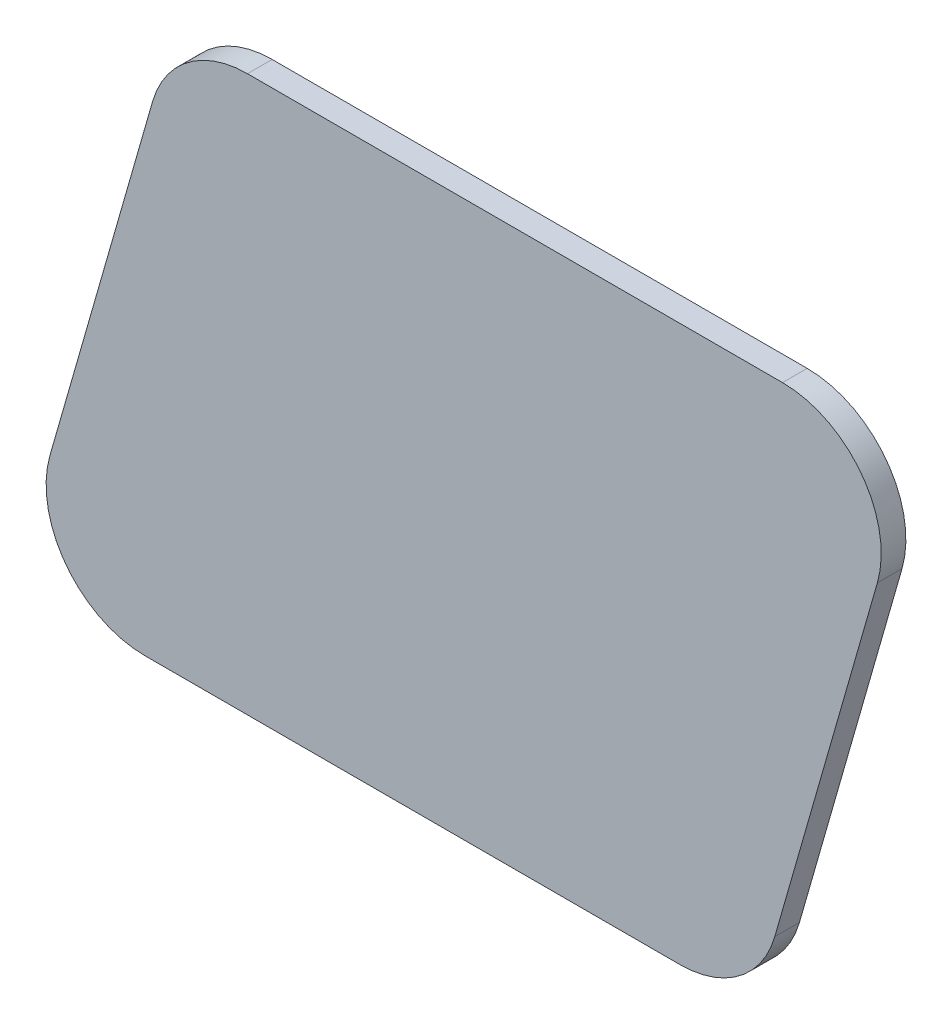
ISO-10303-21;
HEADER;
FILE_DESCRIPTION(('STEP AP214'),'2;1');
FILE_NAME('part.step','',(''),(''),'','','');
FILE_SCHEMA(('AUTOMOTIVE_DESIGN { 1 0 10303 214 1 1 1 1 }'));
ENDSEC;
DATA;
#1=APPLICATION_CONTEXT('core data for automotive mechanical design processes');
#2=APPLICATION_PROTOCOL_DEFINITION('international standard','automotive_design',2000,#1);
#3=PRODUCT_CONTEXT('',#1,'mechanical');
#4=PRODUCT('Part','Part','',(#3));
#5=PRODUCT_RELATED_PRODUCT_CATEGORY('part','',(#4));
#6=PRODUCT_DEFINITION_FORMATION('','',#4);
#7=PRODUCT_DEFINITION_CONTEXT('part definition',#1,'design');
#8=PRODUCT_DEFINITION('design','',#6,#7);
#9=PRODUCT_DEFINITION_SHAPE('','',#8);
#10=(LENGTH_UNIT() NAMED_UNIT(*) SI_UNIT(.MILLI.,.METRE.));
#11=(NAMED_UNIT(*) PLANE_ANGLE_UNIT() SI_UNIT($,.RADIAN.));
#12=(NAMED_UNIT(*) SI_UNIT($,.STERADIAN.) SOLID_ANGLE_UNIT());
#13=UNCERTAINTY_MEASURE_WITH_UNIT(LENGTH_MEASURE(1.E-05),#10,'distance_accuracy_value','');
#14=(GEOMETRIC_REPRESENTATION_CONTEXT(3) GLOBAL_UNCERTAINTY_ASSIGNED_CONTEXT((#13)) GLOBAL_UNIT_ASSIGNED_CONTEXT((#10,
#11,#12)) REPRESENTATION_CONTEXT('',''));
#15=CARTESIAN_POINT('',(0.,0.,0.));
#16=DIRECTION('',(0.,0.,1.));
#17=DIRECTION('',(1.,0.,0.));
#18=AXIS2_PLACEMENT_3D('',#15,#16,#17);
#19=CARTESIAN_POINT('',(10.6172704078727,8.,2.));
#20=DIRECTION('',(0.,0.,-1.));
#21=DIRECTION('',(-1.,0.,0.));
#22=AXIS2_PLACEMENT_3D('',#19,#20,#21);
#23=CYLINDRICAL_SURFACE('',#22,8.);
#24=CARTESIAN_POINT('',(10.6172704078727,8.,0.));
#25=DIRECTION('',(0.,0.,1.));
#26=DIRECTION('',(1.,0.,0.));
#27=AXIS2_PLACEMENT_3D('',#24,#25,#26);
#28=CIRCLE('',#27,8.);
#29=CARTESIAN_POINT('',(2.92735891483814,10.2057337167697,0.));
#30=VERTEX_POINT('',#29);
#31=CARTESIAN_POINT('',(10.6172704078728,0.,0.));
#32=VERTEX_POINT('',#31);
#33=EDGE_CURVE('E130',#30,#32,#28,.T.);
#34=ORIENTED_EDGE('',*,*,#33,.T.);
#35=DIRECTION('',(0.,0.,-1.));
#36=VECTOR('',#35,1.);
#37=CARTESIAN_POINT('',(10.6172704078728,0.,2.));
#38=LINE('',#37,#36);
#39=CARTESIAN_POINT('',(10.6172704078728,0.,2.));
#40=VERTEX_POINT('',#39);
#41=EDGE_CURVE('E11',#40,#32,#38,.T.);
#42=ORIENTED_EDGE('',*,*,#41,.F.);
#43=CARTESIAN_POINT('',(10.6172704078727,8.,2.));
#44=DIRECTION('',(0.,0.,1.));
#45=DIRECTION('',(1.,0.,0.));
#46=AXIS2_PLACEMENT_3D('',#43,#44,#45);
#47=CIRCLE('',#46,8.);
#48=CARTESIAN_POINT('',(2.92735891483814,10.2057337167697,2.));
#49=VERTEX_POINT('',#48);
#50=EDGE_CURVE('E144',#49,#40,#47,.T.);
#51=ORIENTED_EDGE('',*,*,#50,.F.);
#52=DIRECTION('',(0.,0.,-1.));
#53=VECTOR('',#52,1.);
#54=CARTESIAN_POINT('',(2.92735891483814,10.2057337167697,2.));
#55=LINE('',#54,#53);
#56=EDGE_CURVE('E126',#49,#30,#55,.T.);
#57=ORIENTED_EDGE('',*,*,#56,.T.);
#58=EDGE_LOOP('',(#34,#42,#51,#57));
#59=FACE_BOUND('',#58,.T.);
#60=ADVANCED_FACE('F34',(#59),#23,.T.);
#61=CARTESIAN_POINT('',(10.6172704078728,0.,2.));
#62=DIRECTION('',(0.,1.,0.));
#63=DIRECTION('',(0.,0.,1.));
#64=AXIS2_PLACEMENT_3D('',#61,#62,#63);
#65=PLANE('',#64);
#66=DIRECTION('',(1.,0.,0.));
#67=VECTOR('',#66,1.);
#68=CARTESIAN_POINT('',(10.6172704078728,0.,0.));
#69=LINE('',#68,#67);
#70=CARTESIAN_POINT('',(53.9720853344242,0.,0.));
#71=VERTEX_POINT('',#70);
#72=EDGE_CURVE('E133',#32,#71,#69,.T.);
#73=ORIENTED_EDGE('',*,*,#72,.T.);
#74=DIRECTION('',(0.,0.,-1.));
#75=VECTOR('',#74,1.);
#76=CARTESIAN_POINT('',(53.9720853344242,0.,2.));
#77=LINE('',#76,#75);
#78=CARTESIAN_POINT('',(53.9720853344242,0.,2.));
#79=VERTEX_POINT('',#78);
#80=EDGE_CURVE('E42',#79,#71,#77,.T.);
#81=ORIENTED_EDGE('',*,*,#80,.F.);
#82=DIRECTION('',(1.,0.,0.));
#83=VECTOR('',#82,1.);
#84=CARTESIAN_POINT('',(10.6172704078728,0.,2.));
#85=LINE('',#84,#83);
#86=EDGE_CURVE('E93',#40,#79,#85,.T.);
#87=ORIENTED_EDGE('',*,*,#86,.F.);
#88=ORIENTED_EDGE('',*,*,#41,.T.);
#89=EDGE_LOOP('',(#73,#81,#87,#88));
#90=FACE_BOUND('',#89,.T.);
#91=ADVANCED_FACE('F179',(#90),#65,.F.);
#92=CARTESIAN_POINT('',(53.9720853344242,8.,2.));
#93=DIRECTION('',(0.,0.,-1.));
#94=DIRECTION('',(-1.,0.,0.));
#95=AXIS2_PLACEMENT_3D('',#92,#93,#94);
#96=CYLINDRICAL_SURFACE('',#95,8.);
#97=CARTESIAN_POINT('',(53.9720853344242,8.,0.));
#98=DIRECTION('',(0.,0.,1.));
#99=DIRECTION('',(-1.,0.,0.));
#100=AXIS2_PLACEMENT_3D('',#97,#98,#99);
#101=CIRCLE('',#100,8.);
#102=CARTESIAN_POINT('',(61.6619968274588,5.79426628323045,0.));
#103=VERTEX_POINT('',#102);
#104=EDGE_CURVE('E135',#71,#103,#101,.T.);
#105=ORIENTED_EDGE('',*,*,#104,.T.);
#106=DIRECTION('',(0.,0.,-1.));
#107=VECTOR('',#106,1.);
#108=CARTESIAN_POINT('',(61.6619968274588,5.79426628323045,2.));
#109=LINE('',#108,#107);
#110=CARTESIAN_POINT('',(61.6619968274588,5.79426628323045,2.));
#111=VERTEX_POINT('',#110);
#112=EDGE_CURVE('E151',#111,#103,#109,.T.);
#113=ORIENTED_EDGE('',*,*,#112,.F.);
#114=CARTESIAN_POINT('',(53.9720853344242,8.,2.));
#115=DIRECTION('',(0.,0.,1.));
#116=DIRECTION('',(-1.,0.,0.));
#117=AXIS2_PLACEMENT_3D('',#114,#115,#116);
#118=CIRCLE('',#117,8.);
#119=EDGE_CURVE('E159',#79,#111,#118,.T.);
#120=ORIENTED_EDGE('',*,*,#119,.F.);
#121=ORIENTED_EDGE('',*,*,#80,.T.);
#122=EDGE_LOOP('',(#105,#113,#120,#121));
#123=FACE_BOUND('',#122,.T.);
#124=ADVANCED_FACE('F157',(#123),#96,.T.);
#125=CARTESIAN_POINT('',(61.6619968274588,5.79426628323045,2.));
#126=DIRECTION('',(-0.961238936629326,0.275716714596199,0.));
#127=DIRECTION('',(-0.275716714596199,-0.961238936629326,0.));
#128=AXIS2_PLACEMENT_3D('',#125,#126,#127);
#129=PLANE('',#128);
#130=DIRECTION('',(0.275716714596199,0.961238936629326,0.));
#131=VECTOR('',#130,1.);
#132=CARTESIAN_POINT('',(61.6619968274588,5.79426628323045,0.));
#133=LINE('',#132,#131);
#134=CARTESIAN_POINT('',(69.980204110372,34.7942662832303,0.));
#135=VERTEX_POINT('',#134);
#136=EDGE_CURVE('E137',#103,#135,#133,.T.);
#137=ORIENTED_EDGE('',*,*,#136,.T.);
#138=DIRECTION('',(0.,0.,-1.));
#139=VECTOR('',#138,1.);
#140=CARTESIAN_POINT('',(69.980204110372,34.7942662832303,2.));
#141=LINE('',#140,#139);
#142=CARTESIAN_POINT('',(69.980204110372,34.7942662832303,2.));
#143=VERTEX_POINT('',#142);
#144=EDGE_CURVE('E148',#143,#135,#141,.T.);
#145=ORIENTED_EDGE('',*,*,#144,.F.);
#146=DIRECTION('',(0.275716714596199,0.961238936629326,0.));
#147=VECTOR('',#146,1.);
#148=CARTESIAN_POINT('',(61.6619968274588,5.79426628323045,2.));
#149=LINE('',#148,#147);
#150=EDGE_CURVE('E171',#111,#143,#149,.T.);
#151=ORIENTED_EDGE('',*,*,#150,.F.);
#152=ORIENTED_EDGE('',*,*,#112,.T.);
#153=EDGE_LOOP('',(#137,#145,#151,#152));
#154=FACE_BOUND('',#153,.T.);
#155=ADVANCED_FACE('F167',(#154),#129,.F.);
#156=CARTESIAN_POINT('',(62.2902926173374,37.,2.));
#157=DIRECTION('',(0.,0.,-1.));
#158=DIRECTION('',(-1.,0.,0.));
#159=AXIS2_PLACEMENT_3D('',#156,#157,#158);
#160=CYLINDRICAL_SURFACE('',#159,8.);
#161=CARTESIAN_POINT('',(62.2902926173374,37.,0.));
#162=DIRECTION('',(0.,0.,1.));
#163=DIRECTION('',(-1.,0.,0.));
#164=AXIS2_PLACEMENT_3D('',#161,#162,#163);
#165=CIRCLE('',#164,8.);
#166=CARTESIAN_POINT('',(62.2902926173373,45.,0.));
#167=VERTEX_POINT('',#166);
#168=EDGE_CURVE('E139',#135,#167,#165,.T.);
#169=ORIENTED_EDGE('',*,*,#168,.T.);
#170=DIRECTION('',(0.,0.,-1.));
#171=VECTOR('',#170,1.);
#172=CARTESIAN_POINT('',(62.2902926173373,45.,2.));
#173=LINE('',#172,#171);
#174=CARTESIAN_POINT('',(62.2902926173373,45.,2.));
#175=VERTEX_POINT('',#174);
#176=EDGE_CURVE('E121',#175,#167,#173,.T.);
#177=ORIENTED_EDGE('',*,*,#176,.F.);
#178=CARTESIAN_POINT('',(62.2902926173374,37.,2.));
#179=DIRECTION('',(0.,0.,1.));
#180=DIRECTION('',(-1.,0.,0.));
#181=AXIS2_PLACEMENT_3D('',#178,#179,#180);
#182=CIRCLE('',#181,8.);
#183=EDGE_CURVE('E112',#143,#175,#182,.T.);
#184=ORIENTED_EDGE('',*,*,#183,.F.);
#185=ORIENTED_EDGE('',*,*,#144,.T.);
#186=EDGE_LOOP('',(#169,#177,#184,#185));
#187=FACE_BOUND('',#186,.T.);
#188=ADVANCED_FACE('F170',(#187),#160,.T.);
#189=CARTESIAN_POINT('',(18.9354776907859,45.,2.));
#190=DIRECTION('',(0.,-1.,0.));
#191=DIRECTION('',(0.,0.,-1.));
#192=AXIS2_PLACEMENT_3D('',#189,#190,#191);
#193=PLANE('',#192);
#194=DIRECTION('',(-1.,0.,0.));
#195=VECTOR('',#194,1.);
#196=CARTESIAN_POINT('',(18.9354776907859,45.,0.));
#197=LINE('',#196,#195);
#198=CARTESIAN_POINT('',(18.9354776907859,45.,0.));
#199=VERTEX_POINT('',#198);
#200=EDGE_CURVE('E120',#167,#199,#197,.T.);
#201=ORIENTED_EDGE('',*,*,#200,.T.);
#202=DIRECTION('',(0.,0.,-1.));
#203=VECTOR('',#202,1.);
#204=CARTESIAN_POINT('',(18.9354776907859,45.,2.));
#205=LINE('',#204,#203);
#206=CARTESIAN_POINT('',(18.9354776907859,45.,2.));
#207=VERTEX_POINT('',#206);
#208=EDGE_CURVE('E117',#207,#199,#205,.T.);
#209=ORIENTED_EDGE('',*,*,#208,.F.);
#210=DIRECTION('',(-1.,0.,0.));
#211=VECTOR('',#210,1.);
#212=CARTESIAN_POINT('',(18.9354776907859,45.,2.));
#213=LINE('',#212,#211);
#214=EDGE_CURVE('E106',#175,#207,#213,.T.);
#215=ORIENTED_EDGE('',*,*,#214,.F.);
#216=ORIENTED_EDGE('',*,*,#176,.T.);
#217=EDGE_LOOP('',(#201,#209,#215,#216));
#218=FACE_BOUND('',#217,.T.);
#219=ADVANCED_FACE('F118',(#218),#193,.F.);
#220=CARTESIAN_POINT('',(18.9354776907859,37.,2.));
#221=DIRECTION('',(0.,0.,-1.));
#222=DIRECTION('',(-1.,0.,0.));
#223=AXIS2_PLACEMENT_3D('',#220,#221,#222);
#224=CYLINDRICAL_SURFACE('',#223,8.);
#225=CARTESIAN_POINT('',(18.9354776907859,37.,0.));
#226=DIRECTION('',(0.,0.,1.));
#227=DIRECTION('',(1.,0.,0.));
#228=AXIS2_PLACEMENT_3D('',#225,#226,#227);
#229=CIRCLE('',#228,8.);
#230=CARTESIAN_POINT('',(11.2455661977513,39.2057337167696,0.));
#231=VERTEX_POINT('',#230);
#232=EDGE_CURVE('E79',#199,#231,#229,.T.);
#233=ORIENTED_EDGE('',*,*,#232,.T.);
#234=DIRECTION('',(0.,0.,-1.));
#235=VECTOR('',#234,1.);
#236=CARTESIAN_POINT('',(11.2455661977513,39.2057337167696,2.));
#237=LINE('',#236,#235);
#238=CARTESIAN_POINT('',(11.2455661977513,39.2057337167696,2.));
#239=VERTEX_POINT('',#238);
#240=EDGE_CURVE('E122',#239,#231,#237,.T.);
#241=ORIENTED_EDGE('',*,*,#240,.F.);
#242=CARTESIAN_POINT('',(18.9354776907859,37.,2.));
#243=DIRECTION('',(0.,0.,1.));
#244=DIRECTION('',(1.,0.,0.));
#245=AXIS2_PLACEMENT_3D('',#242,#243,#244);
#246=CIRCLE('',#245,8.);
#247=EDGE_CURVE('E110',#207,#239,#246,.T.);
#248=ORIENTED_EDGE('',*,*,#247,.F.);
#249=ORIENTED_EDGE('',*,*,#208,.T.);
#250=EDGE_LOOP('',(#233,#241,#248,#249));
#251=FACE_BOUND('',#250,.T.);
#252=ADVANCED_FACE('F124',(#251),#224,.T.);
#253=CARTESIAN_POINT('',(2.92735891483814,10.2057337167697,2.));
#254=DIRECTION('',(0.961238936629326,-0.275716714596199,0.));
#255=DIRECTION('',(0.275716714596199,0.961238936629327,0.));
#256=AXIS2_PLACEMENT_3D('',#253,#254,#255);
#257=PLANE('',#256);
#258=DIRECTION('',(-0.275716714596199,-0.961238936629326,0.));
#259=VECTOR('',#258,1.);
#260=CARTESIAN_POINT('',(2.92735891483814,10.2057337167697,0.));
#261=LINE('',#260,#259);
#262=EDGE_CURVE('E85',#231,#30,#261,.T.);
#263=ORIENTED_EDGE('',*,*,#262,.T.);
#264=ORIENTED_EDGE('',*,*,#56,.F.);
#265=DIRECTION('',(-0.275716714596199,-0.961238936629326,0.));
#266=VECTOR('',#265,1.);
#267=CARTESIAN_POINT('',(2.92735891483814,10.2057337167697,2.));
#268=LINE('',#267,#266);
#269=EDGE_CURVE('E50',#239,#49,#268,.T.);
#270=ORIENTED_EDGE('',*,*,#269,.F.);
#271=ORIENTED_EDGE('',*,*,#240,.T.);
#272=EDGE_LOOP('',(#263,#264,#270,#271));
#273=FACE_BOUND('',#272,.T.);
#274=ADVANCED_FACE('F195',(#273),#257,.F.);
#275=CARTESIAN_POINT('',(10.6172704078727,8.,2.));
#276=DIRECTION('',(0.,0.,1.));
#277=DIRECTION('',(1.,0.,0.));
#278=AXIS2_PLACEMENT_3D('',#275,#276,#277);
#279=PLANE('',#278);
#280=ORIENTED_EDGE('',*,*,#50,.T.);
#281=ORIENTED_EDGE('',*,*,#86,.T.);
#282=ORIENTED_EDGE('',*,*,#119,.T.);
#283=ORIENTED_EDGE('',*,*,#150,.T.);
#284=ORIENTED_EDGE('',*,*,#183,.T.);
#285=ORIENTED_EDGE('',*,*,#214,.T.);
#286=ORIENTED_EDGE('',*,*,#247,.T.);
#287=ORIENTED_EDGE('',*,*,#269,.T.);
#288=EDGE_LOOP('',(#280,#281,#282,#283,#284,#285,#286,#287));
#289=FACE_BOUND('',#288,.T.);
#290=ADVANCED_FACE('F108',(#289),#279,.T.);
#291=CARTESIAN_POINT('',(10.6172704078727,8.,0.));
#292=DIRECTION('',(0.,0.,1.));
#293=DIRECTION('',(1.,0.,0.));
#294=AXIS2_PLACEMENT_3D('',#291,#292,#293);
#295=PLANE('',#294);
#296=ORIENTED_EDGE('',*,*,#33,.F.);
#297=ORIENTED_EDGE('',*,*,#262,.F.);
#298=ORIENTED_EDGE('',*,*,#232,.F.);
#299=ORIENTED_EDGE('',*,*,#200,.F.);
#300=ORIENTED_EDGE('',*,*,#168,.F.);
#301=ORIENTED_EDGE('',*,*,#136,.F.);
#302=ORIENTED_EDGE('',*,*,#104,.F.);
#303=ORIENTED_EDGE('',*,*,#72,.F.);
#304=EDGE_LOOP('',(#296,#297,#298,#299,#300,#301,#302,#303));
#305=FACE_BOUND('',#304,.T.);
#306=ADVANCED_FACE('F163',(#305),#295,.F.);
#307=CLOSED_SHELL('',(#60,#91,#124,#155,#188,#219,#252,#274,#290,#306));
#308=MANIFOLD_SOLID_BREP('B2',#307);
#309=ADVANCED_BREP_SHAPE_REPRESENTATION('',(#18,#308),#14);
#310=SHAPE_DEFINITION_REPRESENTATION(#9,#309);
ENDSEC;
END-ISO-10303-21;
